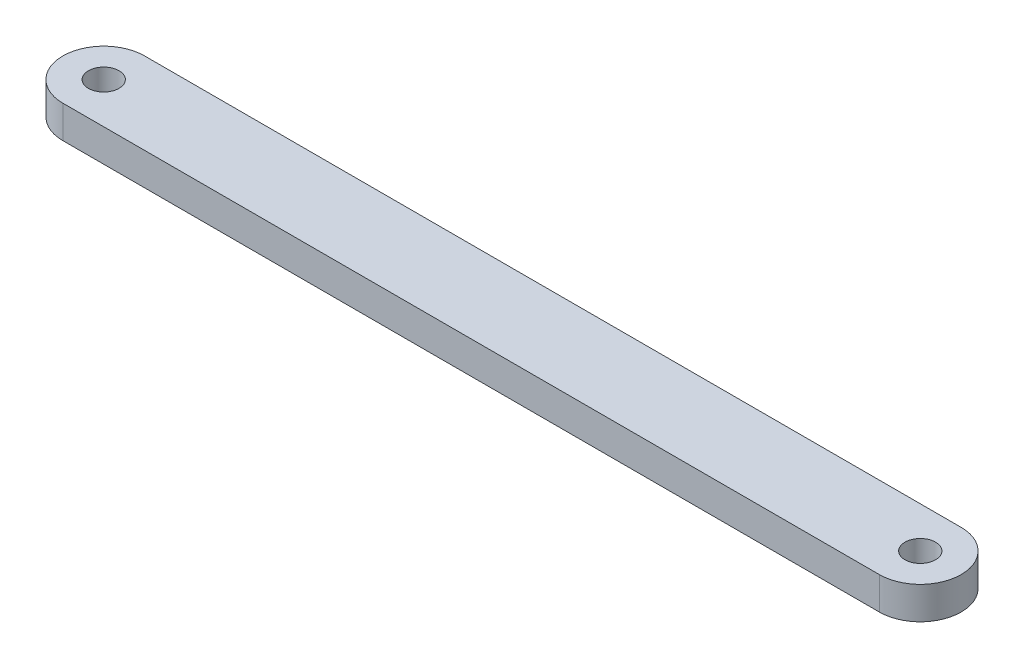
ISO-10303-21;
HEADER;
FILE_DESCRIPTION(('STEP AP214'),'2;1');
FILE_NAME('part.step','',(''),(''),'','','');
FILE_SCHEMA(('AUTOMOTIVE_DESIGN { 1 0 10303 214 1 1 1 1 }'));
ENDSEC;
DATA;
#1=APPLICATION_CONTEXT('core data for automotive mechanical design processes');
#2=APPLICATION_PROTOCOL_DEFINITION('international standard','automotive_design',2000,#1);
#3=PRODUCT_CONTEXT('',#1,'mechanical');
#4=PRODUCT('Part','Part','',(#3));
#5=PRODUCT_RELATED_PRODUCT_CATEGORY('part','',(#4));
#6=PRODUCT_DEFINITION_FORMATION('','',#4);
#7=PRODUCT_DEFINITION_CONTEXT('part definition',#1,'design');
#8=PRODUCT_DEFINITION('design','',#6,#7);
#9=PRODUCT_DEFINITION_SHAPE('','',#8);
#10=(LENGTH_UNIT() NAMED_UNIT(*) SI_UNIT(.MILLI.,.METRE.));
#11=(NAMED_UNIT(*) PLANE_ANGLE_UNIT() SI_UNIT($,.RADIAN.));
#12=(NAMED_UNIT(*) SI_UNIT($,.STERADIAN.) SOLID_ANGLE_UNIT());
#13=UNCERTAINTY_MEASURE_WITH_UNIT(LENGTH_MEASURE(1.E-05),#10,'distance_accuracy_value','');
#14=(GEOMETRIC_REPRESENTATION_CONTEXT(3) GLOBAL_UNCERTAINTY_ASSIGNED_CONTEXT((#13)) GLOBAL_UNIT_ASSIGNED_CONTEXT((#10,
#11,#12)) REPRESENTATION_CONTEXT('',''));
#15=CARTESIAN_POINT('',(0.,0.,0.));
#16=DIRECTION('',(0.,0.,1.));
#17=DIRECTION('',(1.,0.,0.));
#18=AXIS2_PLACEMENT_3D('',#15,#16,#17);
#19=CARTESIAN_POINT('',(40.0183359647131,3.175,-1.80477854883065E-09));
#20=DIRECTION('',(0.,1.,0.));
#21=DIRECTION('',(0.,0.,1.));
#22=AXIS2_PLACEMENT_3D('',#19,#20,#21);
#23=PLANE('',#22);
#24=CARTESIAN_POINT('',(-39.8399602434114,3.175,-1.80477854883065E-09));
#25=DIRECTION('',(0.,1.,0.));
#26=DIRECTION('',(0.,0.,1.));
#27=AXIS2_PLACEMENT_3D('',#24,#25,#26);
#28=CIRCLE('',#27,1.49729345926224);
#29=CARTESIAN_POINT('',(-39.8399602434114,3.175,1.49729345745746));
#30=VERTEX_POINT('',#29);
#31=EDGE_CURVE('E99',#30,#30,#28,.T.);
#32=ORIENTED_EDGE('',*,*,#31,.F.);
#33=EDGE_LOOP('',(#32));
#34=FACE_BOUND('',#33,.T.);
#35=CARTESIAN_POINT('',(40.0183359647131,3.175,-1.80477854883065E-09));
#36=DIRECTION('',(0.,1.,0.));
#37=DIRECTION('',(0.,0.,1.));
#38=AXIS2_PLACEMENT_3D('',#35,#36,#37);
#39=CIRCLE('',#38,4.00009109105304);
#40=CARTESIAN_POINT('',(40.0183359647131,3.175,4.00009108924826));
#41=VERTEX_POINT('',#40);
#42=CARTESIAN_POINT('',(40.0183359647131,3.175,-4.00009109285782));
#43=VERTEX_POINT('',#42);
#44=EDGE_CURVE('E84',#41,#43,#39,.T.);
#45=ORIENTED_EDGE('',*,*,#44,.T.);
#46=DIRECTION('',(-1.,0.,0.));
#47=VECTOR('',#46,1.);
#48=CARTESIAN_POINT('',(40.0183359647131,3.175,-4.00009109285782));
#49=LINE('',#48,#47);
#50=CARTESIAN_POINT('',(-39.8399602434114,3.175,-4.00009109285782));
#51=VERTEX_POINT('',#50);
#52=EDGE_CURVE('E79',#43,#51,#49,.T.);
#53=ORIENTED_EDGE('',*,*,#52,.T.);
#54=CARTESIAN_POINT('',(-39.8399602434114,3.175,-1.80477854883065E-09));
#55=DIRECTION('',(0.,1.,0.));
#56=DIRECTION('',(0.,0.,1.));
#57=AXIS2_PLACEMENT_3D('',#54,#55,#56);
#58=CIRCLE('',#57,4.00009109105304);
#59=CARTESIAN_POINT('',(-39.8399602434114,3.175,4.00009108924826));
#60=VERTEX_POINT('',#59);
#61=EDGE_CURVE('E82',#51,#60,#58,.T.);
#62=ORIENTED_EDGE('',*,*,#61,.T.);
#63=DIRECTION('',(1.,0.,0.));
#64=VECTOR('',#63,1.);
#65=CARTESIAN_POINT('',(-39.8399602434114,3.175,4.00009108924826));
#66=LINE('',#65,#64);
#67=EDGE_CURVE('E49',#60,#41,#66,.T.);
#68=ORIENTED_EDGE('',*,*,#67,.T.);
#69=EDGE_LOOP('',(#45,#53,#62,#68));
#70=FACE_BOUND('',#69,.T.);
#71=CARTESIAN_POINT('',(40.0183359647131,3.175,-1.80477854883065E-09));
#72=DIRECTION('',(0.,1.,0.));
#73=DIRECTION('',(0.,0.,1.));
#74=AXIS2_PLACEMENT_3D('',#71,#72,#73);
#75=CIRCLE('',#74,1.49729345926224);
#76=CARTESIAN_POINT('',(40.0183359647131,3.175,1.49729345745746));
#77=VERTEX_POINT('',#76);
#78=EDGE_CURVE('E114',#77,#77,#75,.T.);
#79=ORIENTED_EDGE('',*,*,#78,.F.);
#80=EDGE_LOOP('',(#79));
#81=FACE_BOUND('',#80,.T.);
#82=ADVANCED_FACE('F32',(#34,#70,#81),#23,.T.);
#83=CARTESIAN_POINT('',(40.0183359647131,0.,-1.80477854883065E-09));
#84=DIRECTION('',(0.,1.,0.));
#85=DIRECTION('',(0.,0.,1.));
#86=AXIS2_PLACEMENT_3D('',#83,#84,#85);
#87=PLANE('',#86);
#88=CARTESIAN_POINT('',(40.0183359647131,0.,-1.80477854883065E-09));
#89=DIRECTION('',(0.,1.,0.));
#90=DIRECTION('',(0.,0.,1.));
#91=AXIS2_PLACEMENT_3D('',#88,#89,#90);
#92=CIRCLE('',#91,4.00009109105304);
#93=CARTESIAN_POINT('',(40.0183359647131,0.,4.00009108924826));
#94=VERTEX_POINT('',#93);
#95=CARTESIAN_POINT('',(40.0183359647131,0.,-4.00009109285782));
#96=VERTEX_POINT('',#95);
#97=EDGE_CURVE('E96',#94,#96,#92,.T.);
#98=ORIENTED_EDGE('',*,*,#97,.F.);
#99=DIRECTION('',(1.,0.,0.));
#100=VECTOR('',#99,1.);
#101=CARTESIAN_POINT('',(-39.8399602434114,0.,4.00009108924826));
#102=LINE('',#101,#100);
#103=CARTESIAN_POINT('',(-39.8399602434114,0.,4.00009108924826));
#104=VERTEX_POINT('',#103);
#105=EDGE_CURVE('E72',#104,#94,#102,.T.);
#106=ORIENTED_EDGE('',*,*,#105,.F.);
#107=CARTESIAN_POINT('',(-39.8399602434114,0.,-1.80477854883065E-09));
#108=DIRECTION('',(0.,1.,0.));
#109=DIRECTION('',(0.,0.,1.));
#110=AXIS2_PLACEMENT_3D('',#107,#108,#109);
#111=CIRCLE('',#110,4.00009109105304);
#112=CARTESIAN_POINT('',(-39.8399602434114,0.,-4.00009109285782));
#113=VERTEX_POINT('',#112);
#114=EDGE_CURVE('E66',#113,#104,#111,.T.);
#115=ORIENTED_EDGE('',*,*,#114,.F.);
#116=DIRECTION('',(-1.,0.,0.));
#117=VECTOR('',#116,1.);
#118=CARTESIAN_POINT('',(40.0183359647131,0.,-4.00009109285782));
#119=LINE('',#118,#117);
#120=EDGE_CURVE('E88',#96,#113,#119,.T.);
#121=ORIENTED_EDGE('',*,*,#120,.F.);
#122=EDGE_LOOP('',(#98,#106,#115,#121));
#123=FACE_BOUND('',#122,.T.);
#124=CARTESIAN_POINT('',(-39.8399602434114,0.,-1.80477854883065E-09));
#125=DIRECTION('',(0.,1.,0.));
#126=DIRECTION('',(0.,0.,1.));
#127=AXIS2_PLACEMENT_3D('',#124,#125,#126);
#128=CIRCLE('',#127,1.49729345926224);
#129=CARTESIAN_POINT('',(-39.8399602434114,0.,1.49729345745746));
#130=VERTEX_POINT('',#129);
#131=EDGE_CURVE('E111',#130,#130,#128,.T.);
#132=ORIENTED_EDGE('',*,*,#131,.T.);
#133=EDGE_LOOP('',(#132));
#134=FACE_BOUND('',#133,.T.);
#135=CARTESIAN_POINT('',(40.0183359647131,0.,-1.80477854883065E-09));
#136=DIRECTION('',(0.,1.,0.));
#137=DIRECTION('',(0.,0.,1.));
#138=AXIS2_PLACEMENT_3D('',#135,#136,#137);
#139=CIRCLE('',#138,1.49729345926224);
#140=CARTESIAN_POINT('',(40.0183359647131,0.,1.49729345745746));
#141=VERTEX_POINT('',#140);
#142=EDGE_CURVE('E117',#141,#141,#139,.T.);
#143=ORIENTED_EDGE('',*,*,#142,.T.);
#144=EDGE_LOOP('',(#143));
#145=FACE_BOUND('',#144,.T.);
#146=ADVANCED_FACE('F107',(#123,#134,#145),#87,.F.);
#147=CARTESIAN_POINT('',(40.0183359647131,3.175,-1.80477854883065E-09));
#148=DIRECTION('',(0.,-1.,0.));
#149=DIRECTION('',(0.,0.,-1.));
#150=AXIS2_PLACEMENT_3D('',#147,#148,#149);
#151=CYLINDRICAL_SURFACE('',#150,4.00009109105304);
#152=ORIENTED_EDGE('',*,*,#97,.T.);
#153=DIRECTION('',(0.,-1.,0.));
#154=VECTOR('',#153,1.);
#155=CARTESIAN_POINT('',(40.0183359647131,3.175,-4.00009109285782));
#156=LINE('',#155,#154);
#157=EDGE_CURVE('E11',#43,#96,#156,.T.);
#158=ORIENTED_EDGE('',*,*,#157,.F.);
#159=ORIENTED_EDGE('',*,*,#44,.F.);
#160=DIRECTION('',(0.,-1.,0.));
#161=VECTOR('',#160,1.);
#162=CARTESIAN_POINT('',(40.0183359647131,3.175,4.00009108924826));
#163=LINE('',#162,#161);
#164=EDGE_CURVE('E92',#41,#94,#163,.T.);
#165=ORIENTED_EDGE('',*,*,#164,.T.);
#166=EDGE_LOOP('',(#152,#158,#159,#165));
#167=FACE_BOUND('',#166,.T.);
#168=ADVANCED_FACE('F34',(#167),#151,.T.);
#169=CARTESIAN_POINT('',(40.0183359647131,3.175,-4.00009109285782));
#170=DIRECTION('',(0.,0.,1.));
#171=DIRECTION('',(1.,0.,0.));
#172=AXIS2_PLACEMENT_3D('',#169,#170,#171);
#173=PLANE('',#172);
#174=ORIENTED_EDGE('',*,*,#120,.T.);
#175=DIRECTION('',(0.,-1.,0.));
#176=VECTOR('',#175,1.);
#177=CARTESIAN_POINT('',(-39.8399602434114,3.175,-4.00009109285782));
#178=LINE('',#177,#176);
#179=EDGE_CURVE('E41',#51,#113,#178,.T.);
#180=ORIENTED_EDGE('',*,*,#179,.F.);
#181=ORIENTED_EDGE('',*,*,#52,.F.);
#182=ORIENTED_EDGE('',*,*,#157,.T.);
#183=EDGE_LOOP('',(#174,#180,#181,#182));
#184=FACE_BOUND('',#183,.T.);
#185=ADVANCED_FACE('F87',(#184),#173,.F.);
#186=CARTESIAN_POINT('',(-39.8399602434114,3.175,-1.80477854883065E-09));
#187=DIRECTION('',(0.,-1.,0.));
#188=DIRECTION('',(0.,0.,-1.));
#189=AXIS2_PLACEMENT_3D('',#186,#187,#188);
#190=CYLINDRICAL_SURFACE('',#189,4.00009109105304);
#191=ORIENTED_EDGE('',*,*,#114,.T.);
#192=DIRECTION('',(0.,-1.,0.));
#193=VECTOR('',#192,1.);
#194=CARTESIAN_POINT('',(-39.8399602434114,3.175,4.00009108924826));
#195=LINE('',#194,#193);
#196=EDGE_CURVE('E89',#60,#104,#195,.T.);
#197=ORIENTED_EDGE('',*,*,#196,.F.);
#198=ORIENTED_EDGE('',*,*,#61,.F.);
#199=ORIENTED_EDGE('',*,*,#179,.T.);
#200=EDGE_LOOP('',(#191,#197,#198,#199));
#201=FACE_BOUND('',#200,.T.);
#202=ADVANCED_FACE('F90',(#201),#190,.T.);
#203=CARTESIAN_POINT('',(-39.8399602434114,3.175,4.00009108924826));
#204=DIRECTION('',(0.,0.,-1.));
#205=DIRECTION('',(-1.,0.,0.));
#206=AXIS2_PLACEMENT_3D('',#203,#204,#205);
#207=PLANE('',#206);
#208=ORIENTED_EDGE('',*,*,#105,.T.);
#209=ORIENTED_EDGE('',*,*,#164,.F.);
#210=ORIENTED_EDGE('',*,*,#67,.F.);
#211=ORIENTED_EDGE('',*,*,#196,.T.);
#212=EDGE_LOOP('',(#208,#209,#210,#211));
#213=FACE_BOUND('',#212,.T.);
#214=ADVANCED_FACE('F104',(#213),#207,.F.);
#215=CARTESIAN_POINT('',(-39.8399602434114,3.175,-1.80477854883065E-09));
#216=DIRECTION('',(0.,-1.,0.));
#217=DIRECTION('',(0.,0.,-1.));
#218=AXIS2_PLACEMENT_3D('',#215,#216,#217);
#219=CYLINDRICAL_SURFACE('',#218,1.49729345926224);
#220=ORIENTED_EDGE('',*,*,#31,.T.);
#221=EDGE_LOOP('',(#220));
#222=FACE_BOUND('',#221,.T.);
#223=ORIENTED_EDGE('',*,*,#131,.F.);
#224=EDGE_LOOP('',(#223));
#225=FACE_BOUND('',#224,.T.);
#226=ADVANCED_FACE('F134',(#222,#225),#219,.F.);
#227=CARTESIAN_POINT('',(40.0183359647131,3.175,-1.80477854883065E-09));
#228=DIRECTION('',(0.,-1.,0.));
#229=DIRECTION('',(0.,0.,-1.));
#230=AXIS2_PLACEMENT_3D('',#227,#228,#229);
#231=CYLINDRICAL_SURFACE('',#230,1.49729345926224);
#232=ORIENTED_EDGE('',*,*,#78,.T.);
#233=EDGE_LOOP('',(#232));
#234=FACE_BOUND('',#233,.T.);
#235=ORIENTED_EDGE('',*,*,#142,.F.);
#236=EDGE_LOOP('',(#235));
#237=FACE_BOUND('',#236,.T.);
#238=ADVANCED_FACE('F123',(#234,#237),#231,.F.);
#239=CLOSED_SHELL('',(#82,#146,#168,#185,#202,#214,#226,#238));
#240=MANIFOLD_SOLID_BREP('B2',#239);
#241=ADVANCED_BREP_SHAPE_REPRESENTATION('',(#18,#240),#14);
#242=SHAPE_DEFINITION_REPRESENTATION(#9,#241);
ENDSEC;
END-ISO-10303-21;
